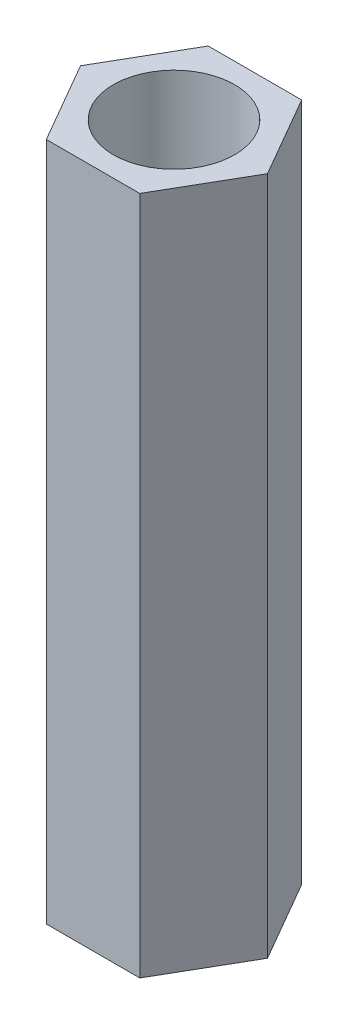
ISO-10303-21;
HEADER;
FILE_DESCRIPTION(('STEP AP214'),'2;1');
FILE_NAME('part.step','',(''),(''),'','','');
FILE_SCHEMA(('AUTOMOTIVE_DESIGN { 1 0 10303 214 1 1 1 1 }'));
ENDSEC;
DATA;
#1=APPLICATION_CONTEXT('core data for automotive mechanical design processes');
#2=APPLICATION_PROTOCOL_DEFINITION('international standard','automotive_design',2000,#1);
#3=PRODUCT_CONTEXT('',#1,'mechanical');
#4=PRODUCT('Part','Part','',(#3));
#5=PRODUCT_RELATED_PRODUCT_CATEGORY('part','',(#4));
#6=PRODUCT_DEFINITION_FORMATION('','',#4);
#7=PRODUCT_DEFINITION_CONTEXT('part definition',#1,'design');
#8=PRODUCT_DEFINITION('design','',#6,#7);
#9=PRODUCT_DEFINITION_SHAPE('','',#8);
#10=(LENGTH_UNIT() NAMED_UNIT(*) SI_UNIT(.MILLI.,.METRE.));
#11=(NAMED_UNIT(*) PLANE_ANGLE_UNIT() SI_UNIT($,.RADIAN.));
#12=(NAMED_UNIT(*) SI_UNIT($,.STERADIAN.) SOLID_ANGLE_UNIT());
#13=UNCERTAINTY_MEASURE_WITH_UNIT(LENGTH_MEASURE(1.E-05),#10,'distance_accuracy_value','');
#14=(GEOMETRIC_REPRESENTATION_CONTEXT(3) GLOBAL_UNCERTAINTY_ASSIGNED_CONTEXT((#13)) GLOBAL_UNIT_ASSIGNED_CONTEXT((#10,
#11,#12)) REPRESENTATION_CONTEXT('',''));
#15=CARTESIAN_POINT('',(0.,0.,0.));
#16=DIRECTION('',(0.,0.,1.));
#17=DIRECTION('',(1.,0.,0.));
#18=AXIS2_PLACEMENT_3D('',#15,#16,#17);
#19=CARTESIAN_POINT('',(0.,25.18,0.));
#20=DIRECTION('',(0.,1.,0.));
#21=DIRECTION('',(0.,0.,1.));
#22=AXIS2_PLACEMENT_3D('',#19,#20,#21);
#23=PLANE('',#22);
#24=DIRECTION('',(1.,0.,0.));
#25=VECTOR('',#24,1.);
#26=CARTESIAN_POINT('',(-1.73205080756888,25.18,3.));
#27=LINE('',#26,#25);
#28=CARTESIAN_POINT('',(-1.73205080756888,25.18,3.));
#29=VERTEX_POINT('',#28);
#30=CARTESIAN_POINT('',(1.73205080756888,25.18,3.));
#31=VERTEX_POINT('',#30);
#32=EDGE_CURVE('E128',#29,#31,#27,.T.);
#33=ORIENTED_EDGE('',*,*,#32,.T.);
#34=DIRECTION('',(0.5,0.,-0.866025403784438));
#35=VECTOR('',#34,1.);
#36=CARTESIAN_POINT('',(1.73205080756888,25.18,3.));
#37=LINE('',#36,#35);
#38=CARTESIAN_POINT('',(3.46410161513776,25.18,0.));
#39=VERTEX_POINT('',#38);
#40=EDGE_CURVE('E86',#31,#39,#37,.T.);
#41=ORIENTED_EDGE('',*,*,#40,.T.);
#42=DIRECTION('',(-0.5,0.,-0.866025403784438));
#43=VECTOR('',#42,1.);
#44=CARTESIAN_POINT('',(3.46410161513776,25.18,0.));
#45=LINE('',#44,#43);
#46=CARTESIAN_POINT('',(1.73205080756888,25.18,-3.));
#47=VERTEX_POINT('',#46);
#48=EDGE_CURVE('E99',#39,#47,#45,.T.);
#49=ORIENTED_EDGE('',*,*,#48,.T.);
#50=DIRECTION('',(-1.,0.,0.));
#51=VECTOR('',#50,1.);
#52=CARTESIAN_POINT('',(1.73205080756888,25.18,-3.));
#53=LINE('',#52,#51);
#54=CARTESIAN_POINT('',(-1.73205080756888,25.18,-3.));
#55=VERTEX_POINT('',#54);
#56=EDGE_CURVE('E93',#47,#55,#53,.T.);
#57=ORIENTED_EDGE('',*,*,#56,.T.);
#58=DIRECTION('',(-0.5,0.,0.866025403784439));
#59=VECTOR('',#58,1.);
#60=CARTESIAN_POINT('',(-1.73205080756888,25.18,-3.));
#61=LINE('',#60,#59);
#62=CARTESIAN_POINT('',(-3.46410161513776,25.18,0.));
#63=VERTEX_POINT('',#62);
#64=EDGE_CURVE('E97',#55,#63,#61,.T.);
#65=ORIENTED_EDGE('',*,*,#64,.T.);
#66=DIRECTION('',(0.5,0.,0.866025403784439));
#67=VECTOR('',#66,1.);
#68=CARTESIAN_POINT('',(-3.46410161513776,25.18,0.));
#69=LINE('',#68,#67);
#70=EDGE_CURVE('E49',#63,#29,#69,.T.);
#71=ORIENTED_EDGE('',*,*,#70,.T.);
#72=EDGE_LOOP('',(#33,#41,#49,#57,#65,#71));
#73=FACE_BOUND('',#72,.T.);
#74=CARTESIAN_POINT('',(0.,25.18,0.));
#75=DIRECTION('',(0.,1.,0.));
#76=DIRECTION('',(0.,0.,1.));
#77=AXIS2_PLACEMENT_3D('',#74,#75,#76);
#78=CIRCLE('',#77,2.25);
#79=CARTESIAN_POINT('',(0.,25.18,2.25));
#80=VERTEX_POINT('',#79);
#81=EDGE_CURVE('E121',#80,#80,#78,.T.);
#82=ORIENTED_EDGE('',*,*,#81,.F.);
#83=EDGE_LOOP('',(#82));
#84=FACE_BOUND('',#83,.T.);
#85=ADVANCED_FACE('F32',(#73,#84),#23,.T.);
#86=CARTESIAN_POINT('',(0.,0.,0.));
#87=DIRECTION('',(0.,1.,0.));
#88=DIRECTION('',(0.,0.,1.));
#89=AXIS2_PLACEMENT_3D('',#86,#87,#88);
#90=PLANE('',#89);
#91=DIRECTION('',(1.,0.,0.));
#92=VECTOR('',#91,1.);
#93=CARTESIAN_POINT('',(-1.73205080756888,0.,3.));
#94=LINE('',#93,#92);
#95=CARTESIAN_POINT('',(-1.73205080756888,0.,3.));
#96=VERTEX_POINT('',#95);
#97=CARTESIAN_POINT('',(1.73205080756888,0.,3.));
#98=VERTEX_POINT('',#97);
#99=EDGE_CURVE('E117',#96,#98,#94,.T.);
#100=ORIENTED_EDGE('',*,*,#99,.F.);
#101=DIRECTION('',(0.5,0.,0.866025403784439));
#102=VECTOR('',#101,1.);
#103=CARTESIAN_POINT('',(-3.46410161513776,0.,0.));
#104=LINE('',#103,#102);
#105=CARTESIAN_POINT('',(-3.46410161513776,0.,0.));
#106=VERTEX_POINT('',#105);
#107=EDGE_CURVE('E78',#106,#96,#104,.T.);
#108=ORIENTED_EDGE('',*,*,#107,.F.);
#109=DIRECTION('',(-0.5,0.,0.866025403784439));
#110=VECTOR('',#109,1.);
#111=CARTESIAN_POINT('',(-1.73205080756888,0.,-3.));
#112=LINE('',#111,#110);
#113=CARTESIAN_POINT('',(-1.73205080756888,0.,-3.));
#114=VERTEX_POINT('',#113);
#115=EDGE_CURVE('E72',#114,#106,#112,.T.);
#116=ORIENTED_EDGE('',*,*,#115,.F.);
#117=DIRECTION('',(-1.,0.,0.));
#118=VECTOR('',#117,1.);
#119=CARTESIAN_POINT('',(1.73205080756888,0.,-3.));
#120=LINE('',#119,#118);
#121=CARTESIAN_POINT('',(1.73205080756888,0.,-3.));
#122=VERTEX_POINT('',#121);
#123=EDGE_CURVE('E107',#122,#114,#120,.T.);
#124=ORIENTED_EDGE('',*,*,#123,.F.);
#125=DIRECTION('',(-0.5,0.,-0.866025403784438));
#126=VECTOR('',#125,1.);
#127=CARTESIAN_POINT('',(3.46410161513776,0.,0.));
#128=LINE('',#127,#126);
#129=CARTESIAN_POINT('',(3.46410161513776,0.,0.));
#130=VERTEX_POINT('',#129);
#131=EDGE_CURVE('E123',#130,#122,#128,.T.);
#132=ORIENTED_EDGE('',*,*,#131,.F.);
#133=DIRECTION('',(0.5,0.,-0.866025403784438));
#134=VECTOR('',#133,1.);
#135=CARTESIAN_POINT('',(1.73205080756888,0.,3.));
#136=LINE('',#135,#134);
#137=EDGE_CURVE('E120',#98,#130,#136,.T.);
#138=ORIENTED_EDGE('',*,*,#137,.F.);
#139=EDGE_LOOP('',(#100,#108,#116,#124,#132,#138));
#140=FACE_BOUND('',#139,.T.);
#141=CARTESIAN_POINT('',(0.,0.,0.));
#142=DIRECTION('',(0.,1.,0.));
#143=DIRECTION('',(0.,0.,1.));
#144=AXIS2_PLACEMENT_3D('',#141,#142,#143);
#145=CIRCLE('',#144,2.25);
#146=CARTESIAN_POINT('',(0.,0.,2.25));
#147=VERTEX_POINT('',#146);
#148=EDGE_CURVE('E221',#147,#147,#145,.T.);
#149=ORIENTED_EDGE('',*,*,#148,.T.);
#150=EDGE_LOOP('',(#149));
#151=FACE_BOUND('',#150,.T.);
#152=ADVANCED_FACE('F137',(#140,#151),#90,.F.);
#153=CARTESIAN_POINT('',(-1.73205080756888,25.18,3.));
#154=DIRECTION('',(0.,0.,-1.));
#155=DIRECTION('',(-1.,0.,0.));
#156=AXIS2_PLACEMENT_3D('',#153,#154,#155);
#157=PLANE('',#156);
#158=ORIENTED_EDGE('',*,*,#99,.T.);
#159=DIRECTION('',(0.,-1.,0.));
#160=VECTOR('',#159,1.);
#161=CARTESIAN_POINT('',(1.73205080756888,25.18,3.));
#162=LINE('',#161,#160);
#163=EDGE_CURVE('E11',#31,#98,#162,.T.);
#164=ORIENTED_EDGE('',*,*,#163,.F.);
#165=ORIENTED_EDGE('',*,*,#32,.F.);
#166=DIRECTION('',(0.,-1.,0.));
#167=VECTOR('',#166,1.);
#168=CARTESIAN_POINT('',(-1.73205080756888,25.18,3.));
#169=LINE('',#168,#167);
#170=EDGE_CURVE('E113',#29,#96,#169,.T.);
#171=ORIENTED_EDGE('',*,*,#170,.T.);
#172=EDGE_LOOP('',(#158,#164,#165,#171));
#173=FACE_BOUND('',#172,.T.);
#174=ADVANCED_FACE('F34',(#173),#157,.F.);
#175=CARTESIAN_POINT('',(1.73205080756888,25.18,3.));
#176=DIRECTION('',(-0.866025403784438,0.,-0.5));
#177=DIRECTION('',(-0.5,0.,0.866025403784439));
#178=AXIS2_PLACEMENT_3D('',#175,#176,#177);
#179=PLANE('',#178);
#180=ORIENTED_EDGE('',*,*,#137,.T.);
#181=DIRECTION('',(0.,-1.,0.));
#182=VECTOR('',#181,1.);
#183=CARTESIAN_POINT('',(3.46410161513776,25.18,0.));
#184=LINE('',#183,#182);
#185=EDGE_CURVE('E41',#39,#130,#184,.T.);
#186=ORIENTED_EDGE('',*,*,#185,.F.);
#187=ORIENTED_EDGE('',*,*,#40,.F.);
#188=ORIENTED_EDGE('',*,*,#163,.T.);
#189=EDGE_LOOP('',(#180,#186,#187,#188));
#190=FACE_BOUND('',#189,.T.);
#191=ADVANCED_FACE('F162',(#190),#179,.F.);
#192=CARTESIAN_POINT('',(3.46410161513776,25.18,0.));
#193=DIRECTION('',(-0.866025403784438,0.,0.5));
#194=DIRECTION('',(0.5,0.,0.866025403784439));
#195=AXIS2_PLACEMENT_3D('',#192,#193,#194);
#196=PLANE('',#195);
#197=ORIENTED_EDGE('',*,*,#131,.T.);
#198=DIRECTION('',(0.,-1.,0.));
#199=VECTOR('',#198,1.);
#200=CARTESIAN_POINT('',(1.73205080756888,25.18,-3.));
#201=LINE('',#200,#199);
#202=EDGE_CURVE('E108',#47,#122,#201,.T.);
#203=ORIENTED_EDGE('',*,*,#202,.F.);
#204=ORIENTED_EDGE('',*,*,#48,.F.);
#205=ORIENTED_EDGE('',*,*,#185,.T.);
#206=EDGE_LOOP('',(#197,#203,#204,#205));
#207=FACE_BOUND('',#206,.T.);
#208=ADVANCED_FACE('F134',(#207),#196,.F.);
#209=CARTESIAN_POINT('',(1.73205080756888,25.18,-3.));
#210=DIRECTION('',(0.,0.,1.));
#211=DIRECTION('',(1.,0.,0.));
#212=AXIS2_PLACEMENT_3D('',#209,#210,#211);
#213=PLANE('',#212);
#214=ORIENTED_EDGE('',*,*,#123,.T.);
#215=DIRECTION('',(0.,-1.,0.));
#216=VECTOR('',#215,1.);
#217=CARTESIAN_POINT('',(-1.73205080756888,25.18,-3.));
#218=LINE('',#217,#216);
#219=EDGE_CURVE('E104',#55,#114,#218,.T.);
#220=ORIENTED_EDGE('',*,*,#219,.F.);
#221=ORIENTED_EDGE('',*,*,#56,.F.);
#222=ORIENTED_EDGE('',*,*,#202,.T.);
#223=EDGE_LOOP('',(#214,#220,#221,#222));
#224=FACE_BOUND('',#223,.T.);
#225=ADVANCED_FACE('F105',(#224),#213,.F.);
#226=CARTESIAN_POINT('',(-1.73205080756888,25.18,-3.));
#227=DIRECTION('',(0.866025403784439,0.,0.5));
#228=DIRECTION('',(0.5,0.,-0.866025403784439));
#229=AXIS2_PLACEMENT_3D('',#226,#227,#228);
#230=PLANE('',#229);
#231=ORIENTED_EDGE('',*,*,#115,.T.);
#232=DIRECTION('',(0.,-1.,0.));
#233=VECTOR('',#232,1.);
#234=CARTESIAN_POINT('',(-3.46410161513776,25.18,0.));
#235=LINE('',#234,#233);
#236=EDGE_CURVE('E109',#63,#106,#235,.T.);
#237=ORIENTED_EDGE('',*,*,#236,.F.);
#238=ORIENTED_EDGE('',*,*,#64,.F.);
#239=ORIENTED_EDGE('',*,*,#219,.T.);
#240=EDGE_LOOP('',(#231,#237,#238,#239));
#241=FACE_BOUND('',#240,.T.);
#242=ADVANCED_FACE('F111',(#241),#230,.F.);
#243=CARTESIAN_POINT('',(-3.46410161513776,25.18,0.));
#244=DIRECTION('',(0.866025403784438,0.,-0.5));
#245=DIRECTION('',(-0.5,0.,-0.866025403784439));
#246=AXIS2_PLACEMENT_3D('',#243,#244,#245);
#247=PLANE('',#246);
#248=ORIENTED_EDGE('',*,*,#107,.T.);
#249=ORIENTED_EDGE('',*,*,#170,.F.);
#250=ORIENTED_EDGE('',*,*,#70,.F.);
#251=ORIENTED_EDGE('',*,*,#236,.T.);
#252=EDGE_LOOP('',(#248,#249,#250,#251));
#253=FACE_BOUND('',#252,.T.);
#254=ADVANCED_FACE('F142',(#253),#247,.F.);
#255=CARTESIAN_POINT('',(0.,25.18,0.));
#256=DIRECTION('',(0.,-1.,0.));
#257=DIRECTION('',(0.,0.,-1.));
#258=AXIS2_PLACEMENT_3D('',#255,#256,#257);
#259=CYLINDRICAL_SURFACE('',#258,2.25);
#260=ORIENTED_EDGE('',*,*,#81,.T.);
#261=EDGE_LOOP('',(#260));
#262=FACE_BOUND('',#261,.T.);
#263=ORIENTED_EDGE('',*,*,#148,.F.);
#264=EDGE_LOOP('',(#263));
#265=FACE_BOUND('',#264,.T.);
#266=ADVANCED_FACE('F144',(#262,#265),#259,.F.);
#267=CLOSED_SHELL('',(#85,#152,#174,#191,#208,#225,#242,#254,#266));
#268=MANIFOLD_SOLID_BREP('B2',#267);
#269=ADVANCED_BREP_SHAPE_REPRESENTATION('',(#18,#268),#14);
#270=SHAPE_DEFINITION_REPRESENTATION(#9,#269);
ENDSEC;
END-ISO-10303-21;
